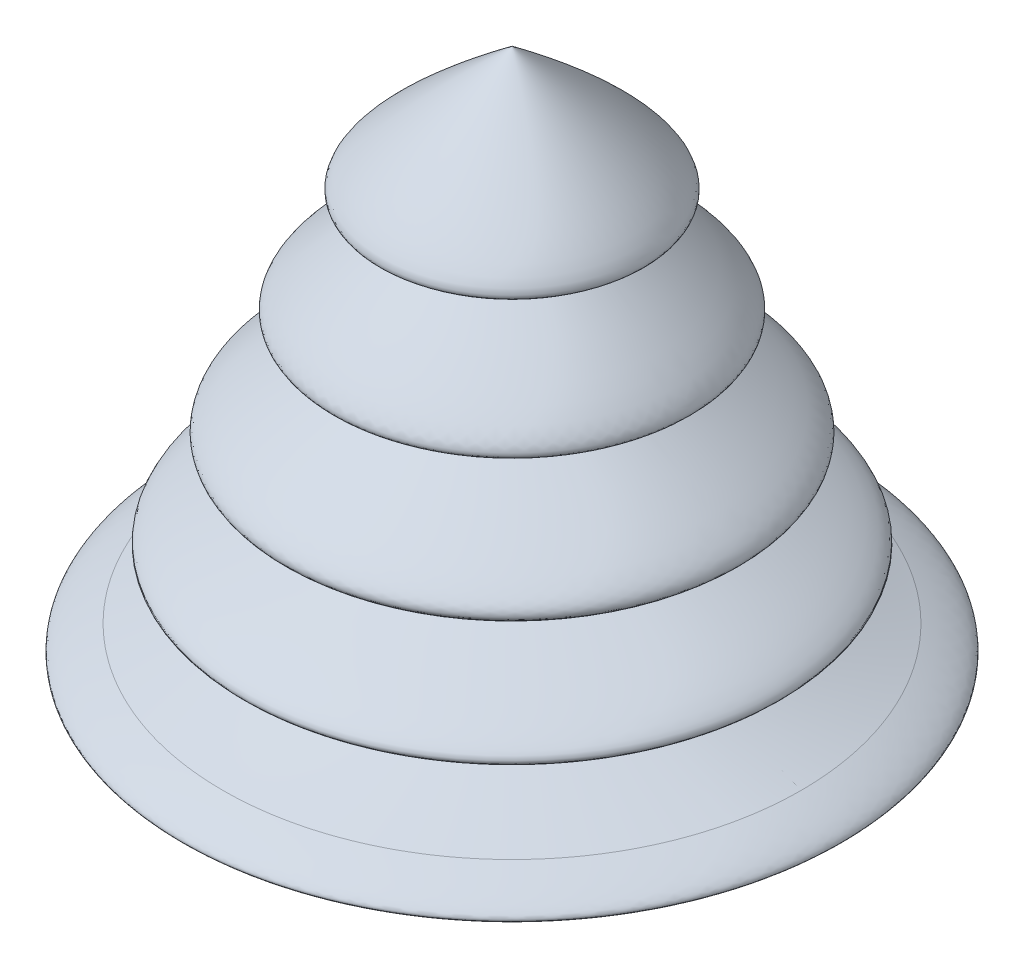
ISO-10303-21;
HEADER;
FILE_DESCRIPTION(('STEP AP214'),'2;1');
FILE_NAME('part.step','',(''),(''),'','','');
FILE_SCHEMA(('AUTOMOTIVE_DESIGN { 1 0 10303 214 1 1 1 1 }'));
ENDSEC;
DATA;
#1=APPLICATION_CONTEXT('core data for automotive mechanical design processes');
#2=APPLICATION_PROTOCOL_DEFINITION('international standard','automotive_design',2000,#1);
#3=PRODUCT_CONTEXT('',#1,'mechanical');
#4=PRODUCT('Part','Part','',(#3));
#5=PRODUCT_RELATED_PRODUCT_CATEGORY('part','',(#4));
#6=PRODUCT_DEFINITION_FORMATION('','',#4);
#7=PRODUCT_DEFINITION_CONTEXT('part definition',#1,'design');
#8=PRODUCT_DEFINITION('design','',#6,#7);
#9=PRODUCT_DEFINITION_SHAPE('','',#8);
#10=(LENGTH_UNIT() NAMED_UNIT(*) SI_UNIT(.MILLI.,.METRE.));
#11=(NAMED_UNIT(*) PLANE_ANGLE_UNIT() SI_UNIT($,.RADIAN.));
#12=(NAMED_UNIT(*) SI_UNIT($,.STERADIAN.) SOLID_ANGLE_UNIT());
#13=UNCERTAINTY_MEASURE_WITH_UNIT(LENGTH_MEASURE(1.E-05),#10,'distance_accuracy_value','');
#14=(GEOMETRIC_REPRESENTATION_CONTEXT(3) GLOBAL_UNCERTAINTY_ASSIGNED_CONTEXT((#13)) GLOBAL_UNIT_ASSIGNED_CONTEXT((#10,
#11,#12)) REPRESENTATION_CONTEXT('',''));
#15=CARTESIAN_POINT('',(0.,0.,0.));
#16=DIRECTION('',(0.,0.,1.));
#17=DIRECTION('',(1.,0.,0.));
#18=AXIS2_PLACEMENT_3D('',#15,#16,#17);
#19=CARTESIAN_POINT('',(47.9366918098374,-2.90387084205349,0.));
#20=CARTESIAN_POINT('',(47.9366897732538,-2.90387053061514,0.));
#21=CARTESIAN_POINT('',(18.7721704898196,8.33697273742374,0.));
#22=CARTESIAN_POINT('',(53.8264212345473,6.03106021384192,0.));
#23=CARTESIAN_POINT('',(29.6516623756298,17.3269760421095,0.));
#24=CARTESIAN_POINT('',(6.47532314498933,25.5387306451754,0.));
#25=CARTESIAN_POINT('',(56.2142266750819,19.2829488954422,0.));
#26=CARTESIAN_POINT('',(-1.176058128083,47.4161234951473,0.));
#27=CARTESIAN_POINT('',(43.3218182218388,35.9180217194387,0.));
#28=CARTESIAN_POINT('',(-16.6520574244773,77.4998691240472,0.));
#29=CARTESIAN_POINT('',(45.7836933777939,44.0412292039443,0.));
#30=CARTESIAN_POINT('',(0.,79.9945980368936,0.));
#31=B_SPLINE_CURVE_WITH_KNOTS('',3,(#19,#20,#21,#22,#23,#24,#25,#26,#27,#28,#29,#30),
.UNSPECIFIED.,.F.,.F.,(4,1,1,1,1,1,1,1,1,4),(0.,0.0785712910909566,0.101972191733313,
0.234009006423566,0.388221477455413,0.523105706754319,0.643949079855857,0.718457563492175,
0.814665529757532,1.),.UNSPECIFIED.);
#32=CARTESIAN_POINT('',(0.,-7.63773070778495,0.));
#33=DIRECTION('',(0.,-1.,0.));
#34=AXIS1_PLACEMENT('',#32,#33);
#35=SURFACE_OF_REVOLUTION('',#31,#34);
#36=CARTESIAN_POINT('',(0.,79.9945980368936,0.));
#37=VERTEX_POINT('',#36);
#38=VERTEX_LOOP('',#37);
#39=FACE_BOUND('',#38,.T.);
#40=CARTESIAN_POINT('',(0.,-2.90387084205349,0.));
#41=DIRECTION('',(0.,-1.,0.));
#42=DIRECTION('',(1.,0.,0.));
#43=AXIS2_PLACEMENT_3D('',#40,#41,#42);
#44=CIRCLE('',#43,47.9366918098374);
#45=CARTESIAN_POINT('',(47.9366918098374,-2.90387084205349,0.));
#46=VERTEX_POINT('',#45);
#47=EDGE_CURVE('E58',#46,#46,#44,.T.);
#48=ORIENTED_EDGE('',*,*,#47,.F.);
#49=EDGE_LOOP('',(#48));
#50=FACE_BOUND('',#49,.T.);
#51=ADVANCED_FACE('F42',(#39,#50),#35,.F.);
#52=CARTESIAN_POINT('',(0.,-7.63773070778495,0.));
#53=DIRECTION('',(0.,-1.,0.));
#54=DIRECTION('',(1.,0.,0.));
#55=AXIS2_PLACEMENT_3D('',#52,#53,#54);
#56=PLANE('',#55);
#57=CARTESIAN_POINT('',(0.,-7.63773070778495,0.));
#58=DIRECTION('',(0.,-1.,0.));
#59=DIRECTION('',(1.,0.,0.));
#60=AXIS2_PLACEMENT_3D('',#57,#58,#59);
#61=CIRCLE('',#60,13.);
#62=CARTESIAN_POINT('',(13.,-7.63773070778495,0.));
#63=VERTEX_POINT('',#62);
#64=EDGE_CURVE('E11',#63,#63,#61,.T.);
#65=ORIENTED_EDGE('',*,*,#64,.F.);
#66=EDGE_LOOP('',(#65));
#67=FACE_BOUND('',#66,.T.);
#68=CARTESIAN_POINT('',(0.,-7.63773070778495,0.));
#69=DIRECTION('',(0.,-1.,0.));
#70=DIRECTION('',(1.,0.,0.));
#71=AXIS2_PLACEMENT_3D('',#68,#69,#70);
#72=CIRCLE('',#71,53.2695478640975);
#73=CARTESIAN_POINT('',(53.2695478640975,-7.63773070778495,0.));
#74=VERTEX_POINT('',#73);
#75=EDGE_CURVE('E46',#74,#74,#72,.T.);
#76=ORIENTED_EDGE('',*,*,#75,.T.);
#77=EDGE_LOOP('',(#76));
#78=FACE_BOUND('',#77,.T.);
#79=ADVANCED_FACE('F55',(#67,#78),#56,.T.);
#80=CARTESIAN_POINT('',(53.2695478640975,-7.63773070778495,0.));
#81=CARTESIAN_POINT('',(56.2020714393694,-7.18534978334687,0.));
#82=CARTESIAN_POINT('',(54.4244525662398,-5.60739639996381,0.));
#83=CARTESIAN_POINT('',(47.9366918098374,-2.90387084205349,0.));
#84=B_SPLINE_CURVE_WITH_KNOTS('',3,(#80,#81,#82,#83),.UNSPECIFIED.,.F.,.F.,(4,4),(0.,
0.713311599932328),.UNSPECIFIED.);
#85=CARTESIAN_POINT('',(0.,-7.63773070778495,0.));
#86=DIRECTION('',(0.,-1.,0.));
#87=AXIS1_PLACEMENT('',#85,#86);
#88=SURFACE_OF_REVOLUTION('',#84,#87);
#89=ORIENTED_EDGE('',*,*,#47,.T.);
#90=EDGE_LOOP('',(#89));
#91=FACE_BOUND('',#90,.T.);
#92=ORIENTED_EDGE('',*,*,#75,.F.);
#93=EDGE_LOOP('',(#92));
#94=FACE_BOUND('',#93,.T.);
#95=ADVANCED_FACE('F75',(#91,#94),#88,.F.);
#96=CARTESIAN_POINT('',(0.,-7.63773070778495,0.));
#97=DIRECTION('',(0.,-1.,0.));
#98=DIRECTION('',(1.,0.,0.));
#99=AXIS2_PLACEMENT_3D('',#96,#97,#98);
#100=CONICAL_SURFACE('',#99,13.,0.5235987755983);
#101=CARTESIAN_POINT('',(0.,-17.637730707785,0.));
#102=DIRECTION('',(0.,-1.,0.));
#103=DIRECTION('',(1.,0.,0.));
#104=AXIS2_PLACEMENT_3D('',#101,#102,#103);
#105=CIRCLE('',#104,18.7735026918963);
#106=CARTESIAN_POINT('',(18.7735026918963,-17.637730707785,0.));
#107=VERTEX_POINT('',#106);
#108=EDGE_CURVE('E60',#107,#107,#105,.T.);
#109=ORIENTED_EDGE('',*,*,#108,.F.);
#110=EDGE_LOOP('',(#109));
#111=FACE_BOUND('',#110,.T.);
#112=ORIENTED_EDGE('',*,*,#64,.T.);
#113=EDGE_LOOP('',(#112));
#114=FACE_BOUND('',#113,.T.);
#115=ADVANCED_FACE('F78',(#111,#114),#100,.T.);
#116=CARTESIAN_POINT('',(0.,-17.637730707785,0.));
#117=DIRECTION('',(0.,-1.,0.));
#118=DIRECTION('',(1.,0.,0.));
#119=AXIS2_PLACEMENT_3D('',#116,#117,#118);
#120=PLANE('',#119);
#121=ORIENTED_EDGE('',*,*,#108,.T.);
#122=EDGE_LOOP('',(#121));
#123=FACE_BOUND('',#122,.T.);
#124=ADVANCED_FACE('F92',(#123),#120,.T.);
#125=CLOSED_SHELL('',(#51,#79,#95,#115,#124));
#126=MANIFOLD_SOLID_BREP('B2',#125);
#127=ADVANCED_BREP_SHAPE_REPRESENTATION('',(#18,#126),#14);
#128=SHAPE_DEFINITION_REPRESENTATION(#9,#127);
ENDSEC;
END-ISO-10303-21;
